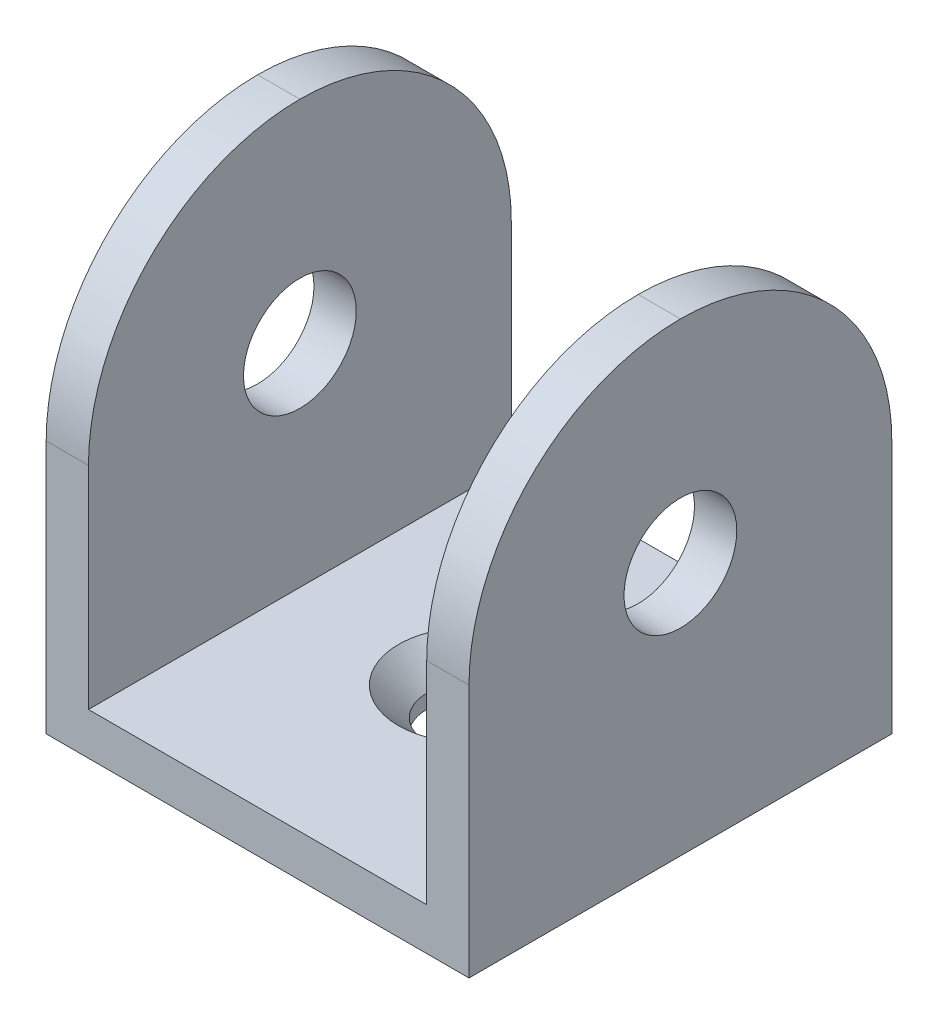
ISO-10303-21;
HEADER;
FILE_DESCRIPTION(('STEP AP214'),'2;1');
FILE_NAME('part.step','',(''),(''),'','','');
FILE_SCHEMA(('AUTOMOTIVE_DESIGN { 1 0 10303 214 1 1 1 1 }'));
ENDSEC;
DATA;
#1=APPLICATION_CONTEXT('core data for automotive mechanical design processes');
#2=APPLICATION_PROTOCOL_DEFINITION('international standard','automotive_design',2000,#1);
#3=PRODUCT_CONTEXT('',#1,'mechanical');
#4=PRODUCT('Part','Part','',(#3));
#5=PRODUCT_RELATED_PRODUCT_CATEGORY('part','',(#4));
#6=PRODUCT_DEFINITION_FORMATION('','',#4);
#7=PRODUCT_DEFINITION_CONTEXT('part definition',#1,'design');
#8=PRODUCT_DEFINITION('design','',#6,#7);
#9=PRODUCT_DEFINITION_SHAPE('','',#8);
#10=(LENGTH_UNIT() NAMED_UNIT(*) SI_UNIT(.MILLI.,.METRE.));
#11=(NAMED_UNIT(*) PLANE_ANGLE_UNIT() SI_UNIT($,.RADIAN.));
#12=(NAMED_UNIT(*) SI_UNIT($,.STERADIAN.) SOLID_ANGLE_UNIT());
#13=UNCERTAINTY_MEASURE_WITH_UNIT(LENGTH_MEASURE(1.E-05),#10,'distance_accuracy_value','');
#14=(GEOMETRIC_REPRESENTATION_CONTEXT(3) GLOBAL_UNCERTAINTY_ASSIGNED_CONTEXT((#13)) GLOBAL_UNIT_ASSIGNED_CONTEXT((#10,
#11,#12)) REPRESENTATION_CONTEXT('',''));
#15=CARTESIAN_POINT('',(0.,0.,0.));
#16=DIRECTION('',(0.,0.,1.));
#17=DIRECTION('',(1.,0.,0.));
#18=AXIS2_PLACEMENT_3D('',#15,#16,#17);
#19=CARTESIAN_POINT('',(0.,3.,0.));
#20=DIRECTION('',(0.,1.,0.));
#21=DIRECTION('',(0.,0.,1.));
#22=AXIS2_PLACEMENT_3D('',#19,#20,#21);
#23=PLANE('',#22);
#24=CARTESIAN_POINT('',(0.,3.,0.));
#25=DIRECTION('',(0.,1.,0.));
#26=DIRECTION('',(0.,0.,1.));
#27=AXIS2_PLACEMENT_3D('',#24,#25,#26);
#28=CIRCLE('',#27,5.00000000000001);
#29=CARTESIAN_POINT('',(0.,3.,5.00000000000001));
#30=VERTEX_POINT('',#29);
#31=EDGE_CURVE('E11',#30,#30,#28,.F.);
#32=ORIENTED_EDGE('',*,*,#31,.T.);
#33=EDGE_LOOP('',(#32));
#34=FACE_BOUND('',#33,.T.);
#35=DIRECTION('',(1.,0.,0.));
#36=VECTOR('',#35,1.);
#37=CARTESIAN_POINT('',(15.,3.,15.));
#38=LINE('',#37,#36);
#39=CARTESIAN_POINT('',(-12.,3.,15.));
#40=VERTEX_POINT('',#39);
#41=CARTESIAN_POINT('',(12.,3.,15.));
#42=VERTEX_POINT('',#41);
#43=EDGE_CURVE('E146',#40,#42,#38,.T.);
#44=ORIENTED_EDGE('',*,*,#43,.T.);
#45=DIRECTION('',(0.,0.,1.));
#46=VECTOR('',#45,1.);
#47=CARTESIAN_POINT('',(12.,3.,-15.));
#48=LINE('',#47,#46);
#49=CARTESIAN_POINT('',(12.,3.,-15.));
#50=VERTEX_POINT('',#49);
#51=EDGE_CURVE('E143',#50,#42,#48,.T.);
#52=ORIENTED_EDGE('',*,*,#51,.F.);
#53=DIRECTION('',(-1.,0.,0.));
#54=VECTOR('',#53,1.);
#55=CARTESIAN_POINT('',(15.,3.,-15.));
#56=LINE('',#55,#54);
#57=CARTESIAN_POINT('',(-12.,3.,-15.));
#58=VERTEX_POINT('',#57);
#59=EDGE_CURVE('E128',#50,#58,#56,.T.);
#60=ORIENTED_EDGE('',*,*,#59,.T.);
#61=DIRECTION('',(0.,0.,-1.));
#62=VECTOR('',#61,1.);
#63=CARTESIAN_POINT('',(-12.,3.,-15.));
#64=LINE('',#63,#62);
#65=EDGE_CURVE('E135',#40,#58,#64,.T.);
#66=ORIENTED_EDGE('',*,*,#65,.F.);
#67=EDGE_LOOP('',(#44,#52,#60,#66));
#68=FACE_BOUND('',#67,.T.);
#69=ADVANCED_FACE('F45',(#34,#68),#23,.T.);
#70=CARTESIAN_POINT('',(-15.,3.,15.));
#71=DIRECTION('',(1.,0.,0.));
#72=DIRECTION('',(0.,0.,-1.));
#73=AXIS2_PLACEMENT_3D('',#70,#71,#72);
#74=PLANE('',#73);
#75=CARTESIAN_POINT('',(-15.,18.,0.));
#76=DIRECTION('',(1.,0.,0.));
#77=DIRECTION('',(0.,0.,-1.));
#78=AXIS2_PLACEMENT_3D('',#75,#76,#77);
#79=CIRCLE('',#78,4.);
#80=CARTESIAN_POINT('',(-15.,18.,-4.));
#81=VERTEX_POINT('',#80);
#82=EDGE_CURVE('E235',#81,#81,#79,.T.);
#83=ORIENTED_EDGE('',*,*,#82,.T.);
#84=EDGE_LOOP('',(#83));
#85=FACE_BOUND('',#84,.T.);
#86=CARTESIAN_POINT('',(-15.,18.,0.));
#87=DIRECTION('',(1.,0.,0.));
#88=DIRECTION('',(0.,0.,-1.));
#89=AXIS2_PLACEMENT_3D('',#86,#87,#88);
#90=CIRCLE('',#89,15.);
#91=CARTESIAN_POINT('',(-15.,18.,15.));
#92=VERTEX_POINT('',#91);
#93=CARTESIAN_POINT('',(-15.,33.,0.));
#94=VERTEX_POINT('',#93);
#95=EDGE_CURVE('E188',#92,#94,#90,.F.);
#96=ORIENTED_EDGE('',*,*,#95,.T.);
#97=CARTESIAN_POINT('',(-15.,18.,0.));
#98=DIRECTION('',(1.,0.,0.));
#99=DIRECTION('',(0.,0.,-1.));
#100=AXIS2_PLACEMENT_3D('',#97,#98,#99);
#101=CIRCLE('',#100,15.);
#102=CARTESIAN_POINT('',(-15.,18.,-15.));
#103=VERTEX_POINT('',#102);
#104=EDGE_CURVE('E191',#94,#103,#101,.F.);
#105=ORIENTED_EDGE('',*,*,#104,.T.);
#106=DIRECTION('',(0.,-1.,0.));
#107=VECTOR('',#106,1.);
#108=CARTESIAN_POINT('',(-15.,3.,-15.));
#109=LINE('',#108,#107);
#110=CARTESIAN_POINT('',(-15.,0.,-15.));
#111=VERTEX_POINT('',#110);
#112=EDGE_CURVE('E145',#103,#111,#109,.T.);
#113=ORIENTED_EDGE('',*,*,#112,.T.);
#114=DIRECTION('',(0.,0.,1.));
#115=VECTOR('',#114,1.);
#116=CARTESIAN_POINT('',(-15.,0.,15.));
#117=LINE('',#116,#115);
#118=CARTESIAN_POINT('',(-15.,0.,15.));
#119=VERTEX_POINT('',#118);
#120=EDGE_CURVE('E159',#111,#119,#117,.T.);
#121=ORIENTED_EDGE('',*,*,#120,.T.);
#122=DIRECTION('',(0.,-1.,0.));
#123=VECTOR('',#122,1.);
#124=CARTESIAN_POINT('',(-15.,3.,15.));
#125=LINE('',#124,#123);
#126=EDGE_CURVE('E185',#92,#119,#125,.T.);
#127=ORIENTED_EDGE('',*,*,#126,.F.);
#128=EDGE_LOOP('',(#96,#105,#113,#121,#127));
#129=FACE_BOUND('',#128,.T.);
#130=ADVANCED_FACE('F252',(#85,#129),#74,.F.);
#131=CARTESIAN_POINT('',(15.,3.,15.));
#132=DIRECTION('',(0.,0.,-1.));
#133=DIRECTION('',(-1.,0.,0.));
#134=AXIS2_PLACEMENT_3D('',#131,#132,#133);
#135=PLANE('',#134);
#136=DIRECTION('',(0.,-1.,0.));
#137=VECTOR('',#136,1.);
#138=CARTESIAN_POINT('',(15.,3.,15.));
#139=LINE('',#138,#137);
#140=CARTESIAN_POINT('',(15.,18.,15.));
#141=VERTEX_POINT('',#140);
#142=CARTESIAN_POINT('',(15.,0.,15.));
#143=VERTEX_POINT('',#142);
#144=EDGE_CURVE('E182',#141,#143,#139,.T.);
#145=ORIENTED_EDGE('',*,*,#144,.F.);
#146=DIRECTION('',(1.,0.,0.));
#147=VECTOR('',#146,1.);
#148=CARTESIAN_POINT('',(15.,18.,15.));
#149=LINE('',#148,#147);
#150=CARTESIAN_POINT('',(12.,18.,15.));
#151=VERTEX_POINT('',#150);
#152=EDGE_CURVE('E219',#141,#151,#149,.F.);
#153=ORIENTED_EDGE('',*,*,#152,.T.);
#154=DIRECTION('',(0.,-1.,0.));
#155=VECTOR('',#154,1.);
#156=CARTESIAN_POINT('',(12.,33.,15.));
#157=LINE('',#156,#155);
#158=EDGE_CURVE('E153',#151,#42,#157,.T.);
#159=ORIENTED_EDGE('',*,*,#158,.T.);
#160=ORIENTED_EDGE('',*,*,#43,.F.);
#161=DIRECTION('',(0.,-1.,0.));
#162=VECTOR('',#161,1.);
#163=CARTESIAN_POINT('',(-12.,33.,15.));
#164=LINE('',#163,#162);
#165=CARTESIAN_POINT('',(-12.,18.,15.));
#166=VERTEX_POINT('',#165);
#167=EDGE_CURVE('E134',#166,#40,#164,.T.);
#168=ORIENTED_EDGE('',*,*,#167,.F.);
#169=DIRECTION('',(1.,0.,0.));
#170=VECTOR('',#169,1.);
#171=CARTESIAN_POINT('',(-15.,18.,15.));
#172=LINE('',#171,#170);
#173=EDGE_CURVE('E216',#166,#92,#172,.F.);
#174=ORIENTED_EDGE('',*,*,#173,.T.);
#175=ORIENTED_EDGE('',*,*,#126,.T.);
#176=DIRECTION('',(1.,0.,0.));
#177=VECTOR('',#176,1.);
#178=CARTESIAN_POINT('',(15.,0.,15.));
#179=LINE('',#178,#177);
#180=EDGE_CURVE('E166',#119,#143,#179,.T.);
#181=ORIENTED_EDGE('',*,*,#180,.T.);
#182=EDGE_LOOP('',(#145,#153,#159,#160,#168,#174,#175,#181));
#183=FACE_BOUND('',#182,.T.);
#184=ADVANCED_FACE('F258',(#183),#135,.F.);
#185=CARTESIAN_POINT('',(15.,3.,15.));
#186=DIRECTION('',(-1.,0.,0.));
#187=DIRECTION('',(0.,0.,1.));
#188=AXIS2_PLACEMENT_3D('',#185,#186,#187);
#189=PLANE('',#188);
#190=CARTESIAN_POINT('',(15.,18.,0.));
#191=DIRECTION('',(1.,0.,0.));
#192=DIRECTION('',(0.,0.,-1.));
#193=AXIS2_PLACEMENT_3D('',#190,#191,#192);
#194=CIRCLE('',#193,4.);
#195=CARTESIAN_POINT('',(15.,18.,-4.));
#196=VERTEX_POINT('',#195);
#197=EDGE_CURVE('E307',#196,#196,#194,.T.);
#198=ORIENTED_EDGE('',*,*,#197,.F.);
#199=EDGE_LOOP('',(#198));
#200=FACE_BOUND('',#199,.T.);
#201=DIRECTION('',(0.,-1.,0.));
#202=VECTOR('',#201,1.);
#203=CARTESIAN_POINT('',(15.,3.,-15.));
#204=LINE('',#203,#202);
#205=CARTESIAN_POINT('',(15.,18.,-15.));
#206=VERTEX_POINT('',#205);
#207=CARTESIAN_POINT('',(15.,0.,-15.));
#208=VERTEX_POINT('',#207);
#209=EDGE_CURVE('E179',#206,#208,#204,.T.);
#210=ORIENTED_EDGE('',*,*,#209,.F.);
#211=CARTESIAN_POINT('',(15.,18.,0.));
#212=DIRECTION('',(-1.,0.,0.));
#213=DIRECTION('',(0.,0.,1.));
#214=AXIS2_PLACEMENT_3D('',#211,#212,#213);
#215=CIRCLE('',#214,15.);
#216=CARTESIAN_POINT('',(15.,33.,0.));
#217=VERTEX_POINT('',#216);
#218=EDGE_CURVE('E67',#206,#217,#215,.F.);
#219=ORIENTED_EDGE('',*,*,#218,.T.);
#220=CARTESIAN_POINT('',(15.,18.,0.));
#221=DIRECTION('',(-1.,0.,0.));
#222=DIRECTION('',(0.,0.,1.));
#223=AXIS2_PLACEMENT_3D('',#220,#221,#222);
#224=CIRCLE('',#223,15.);
#225=EDGE_CURVE('E62',#217,#141,#224,.F.);
#226=ORIENTED_EDGE('',*,*,#225,.T.);
#227=ORIENTED_EDGE('',*,*,#144,.T.);
#228=DIRECTION('',(0.,0.,-1.));
#229=VECTOR('',#228,1.);
#230=CARTESIAN_POINT('',(15.,0.,15.));
#231=LINE('',#230,#229);
#232=EDGE_CURVE('E170',#143,#208,#231,.T.);
#233=ORIENTED_EDGE('',*,*,#232,.T.);
#234=EDGE_LOOP('',(#210,#219,#226,#227,#233));
#235=FACE_BOUND('',#234,.T.);
#236=ADVANCED_FACE('F270',(#200,#235),#189,.F.);
#237=CARTESIAN_POINT('',(15.,3.,-15.));
#238=DIRECTION('',(0.,0.,1.));
#239=DIRECTION('',(1.,0.,0.));
#240=AXIS2_PLACEMENT_3D('',#237,#238,#239);
#241=PLANE('',#240);
#242=ORIENTED_EDGE('',*,*,#112,.F.);
#243=DIRECTION('',(-1.,0.,0.));
#244=VECTOR('',#243,1.);
#245=CARTESIAN_POINT('',(-12.,18.,-15.));
#246=LINE('',#245,#244);
#247=CARTESIAN_POINT('',(-12.,18.,-15.));
#248=VERTEX_POINT('',#247);
#249=EDGE_CURVE('E130',#103,#248,#246,.F.);
#250=ORIENTED_EDGE('',*,*,#249,.T.);
#251=DIRECTION('',(0.,-1.,0.));
#252=VECTOR('',#251,1.);
#253=CARTESIAN_POINT('',(-12.,33.,-15.));
#254=LINE('',#253,#252);
#255=EDGE_CURVE('E123',#248,#58,#254,.T.);
#256=ORIENTED_EDGE('',*,*,#255,.T.);
#257=ORIENTED_EDGE('',*,*,#59,.F.);
#258=DIRECTION('',(0.,-1.,0.));
#259=VECTOR('',#258,1.);
#260=CARTESIAN_POINT('',(12.,33.,-15.));
#261=LINE('',#260,#259);
#262=CARTESIAN_POINT('',(12.,18.,-15.));
#263=VERTEX_POINT('',#262);
#264=EDGE_CURVE('E226',#263,#50,#261,.T.);
#265=ORIENTED_EDGE('',*,*,#264,.F.);
#266=DIRECTION('',(-1.,0.,0.));
#267=VECTOR('',#266,1.);
#268=CARTESIAN_POINT('',(15.,18.,-15.));
#269=LINE('',#268,#267);
#270=EDGE_CURVE('E194',#263,#206,#269,.F.);
#271=ORIENTED_EDGE('',*,*,#270,.T.);
#272=ORIENTED_EDGE('',*,*,#209,.T.);
#273=DIRECTION('',(-1.,0.,0.));
#274=VECTOR('',#273,1.);
#275=CARTESIAN_POINT('',(15.,0.,-15.));
#276=LINE('',#275,#274);
#277=EDGE_CURVE('E161',#208,#111,#276,.T.);
#278=ORIENTED_EDGE('',*,*,#277,.T.);
#279=EDGE_LOOP('',(#242,#250,#256,#257,#265,#271,#272,#278));
#280=FACE_BOUND('',#279,.T.);
#281=ADVANCED_FACE('F126',(#280),#241,.F.);
#282=CARTESIAN_POINT('',(0.,0.,0.));
#283=DIRECTION('',(0.,1.,0.));
#284=DIRECTION('',(0.,0.,1.));
#285=AXIS2_PLACEMENT_3D('',#282,#283,#284);
#286=PLANE('',#285);
#287=CARTESIAN_POINT('',(0.,0.,0.));
#288=DIRECTION('',(0.,1.,0.));
#289=DIRECTION('',(0.,0.,1.));
#290=AXIS2_PLACEMENT_3D('',#287,#288,#289);
#291=CIRCLE('',#290,3.);
#292=CARTESIAN_POINT('',(0.,0.,3.));
#293=VERTEX_POINT('',#292);
#294=EDGE_CURVE('E311',#293,#293,#291,.T.);
#295=ORIENTED_EDGE('',*,*,#294,.T.);
#296=EDGE_LOOP('',(#295));
#297=FACE_BOUND('',#296,.T.);
#298=ORIENTED_EDGE('',*,*,#120,.F.);
#299=ORIENTED_EDGE('',*,*,#277,.F.);
#300=ORIENTED_EDGE('',*,*,#232,.F.);
#301=ORIENTED_EDGE('',*,*,#180,.F.);
#302=EDGE_LOOP('',(#298,#299,#300,#301));
#303=FACE_BOUND('',#302,.T.);
#304=ADVANCED_FACE('F264',(#297,#303),#286,.F.);
#305=CARTESIAN_POINT('',(-12.,33.,-15.));
#306=DIRECTION('',(-1.,0.,0.));
#307=DIRECTION('',(0.,0.,1.));
#308=AXIS2_PLACEMENT_3D('',#305,#306,#307);
#309=PLANE('',#308);
#310=CARTESIAN_POINT('',(-12.,18.,0.));
#311=DIRECTION('',(-1.,0.,0.));
#312=DIRECTION('',(0.,0.,1.));
#313=AXIS2_PLACEMENT_3D('',#310,#311,#312);
#314=CIRCLE('',#313,4.);
#315=CARTESIAN_POINT('',(-12.,18.,4.));
#316=VERTEX_POINT('',#315);
#317=EDGE_CURVE('E231',#316,#316,#314,.T.);
#318=ORIENTED_EDGE('',*,*,#317,.T.);
#319=EDGE_LOOP('',(#318));
#320=FACE_BOUND('',#319,.T.);
#321=ORIENTED_EDGE('',*,*,#255,.F.);
#322=CARTESIAN_POINT('',(-12.,18.,0.));
#323=DIRECTION('',(-1.,0.,0.));
#324=DIRECTION('',(0.,0.,1.));
#325=AXIS2_PLACEMENT_3D('',#322,#323,#324);
#326=CIRCLE('',#325,15.);
#327=CARTESIAN_POINT('',(-12.,33.,0.));
#328=VERTEX_POINT('',#327);
#329=EDGE_CURVE('E203',#248,#328,#326,.F.);
#330=ORIENTED_EDGE('',*,*,#329,.T.);
#331=CARTESIAN_POINT('',(-12.,18.,0.));
#332=DIRECTION('',(-1.,0.,0.));
#333=DIRECTION('',(0.,0.,1.));
#334=AXIS2_PLACEMENT_3D('',#331,#332,#333);
#335=CIRCLE('',#334,15.);
#336=EDGE_CURVE('E200',#328,#166,#335,.F.);
#337=ORIENTED_EDGE('',*,*,#336,.T.);
#338=ORIENTED_EDGE('',*,*,#167,.T.);
#339=ORIENTED_EDGE('',*,*,#65,.T.);
#340=EDGE_LOOP('',(#321,#330,#337,#338,#339));
#341=FACE_BOUND('',#340,.T.);
#342=ADVANCED_FACE('F148',(#320,#341),#309,.F.);
#343=CARTESIAN_POINT('',(12.,33.,-15.));
#344=DIRECTION('',(1.,0.,0.));
#345=DIRECTION('',(0.,0.,-1.));
#346=AXIS2_PLACEMENT_3D('',#343,#344,#345);
#347=PLANE('',#346);
#348=CARTESIAN_POINT('',(12.,18.,0.));
#349=DIRECTION('',(1.,0.,0.));
#350=DIRECTION('',(0.,0.,-1.));
#351=AXIS2_PLACEMENT_3D('',#348,#349,#350);
#352=CIRCLE('',#351,4.);
#353=CARTESIAN_POINT('',(12.,18.,-4.));
#354=VERTEX_POINT('',#353);
#355=EDGE_CURVE('E232',#354,#354,#352,.T.);
#356=ORIENTED_EDGE('',*,*,#355,.T.);
#357=EDGE_LOOP('',(#356));
#358=FACE_BOUND('',#357,.T.);
#359=CARTESIAN_POINT('',(12.,18.,0.));
#360=DIRECTION('',(1.,0.,0.));
#361=DIRECTION('',(0.,0.,-1.));
#362=AXIS2_PLACEMENT_3D('',#359,#360,#361);
#363=CIRCLE('',#362,15.);
#364=CARTESIAN_POINT('',(12.,33.,0.));
#365=VERTEX_POINT('',#364);
#366=EDGE_CURVE('E206',#151,#365,#363,.F.);
#367=ORIENTED_EDGE('',*,*,#366,.T.);
#368=CARTESIAN_POINT('',(12.,18.,0.));
#369=DIRECTION('',(1.,0.,0.));
#370=DIRECTION('',(0.,0.,-1.));
#371=AXIS2_PLACEMENT_3D('',#368,#369,#370);
#372=CIRCLE('',#371,15.);
#373=EDGE_CURVE('E209',#365,#263,#372,.F.);
#374=ORIENTED_EDGE('',*,*,#373,.T.);
#375=ORIENTED_EDGE('',*,*,#264,.T.);
#376=ORIENTED_EDGE('',*,*,#51,.T.);
#377=ORIENTED_EDGE('',*,*,#158,.F.);
#378=EDGE_LOOP('',(#367,#374,#375,#376,#377));
#379=FACE_BOUND('',#378,.T.);
#380=ADVANCED_FACE('F285',(#358,#379),#347,.F.);
#381=CARTESIAN_POINT('',(0.,18.,0.));
#382=DIRECTION('',(-1.,0.,0.));
#383=DIRECTION('',(0.,0.,1.));
#384=AXIS2_PLACEMENT_3D('',#381,#382,#383);
#385=CYLINDRICAL_SURFACE('',#384,15.);
#386=ORIENTED_EDGE('',*,*,#173,.F.);
#387=ORIENTED_EDGE('',*,*,#336,.F.);
#388=DIRECTION('',(1.,0.,0.));
#389=VECTOR('',#388,1.);
#390=CARTESIAN_POINT('',(-12.,33.,0.));
#391=LINE('',#390,#389);
#392=EDGE_CURVE('E222',#94,#328,#391,.T.);
#393=ORIENTED_EDGE('',*,*,#392,.F.);
#394=ORIENTED_EDGE('',*,*,#95,.F.);
#395=EDGE_LOOP('',(#386,#387,#393,#394));
#396=FACE_BOUND('',#395,.T.);
#397=ADVANCED_FACE('F281',(#396),#385,.T.);
#398=CARTESIAN_POINT('',(0.,18.,0.));
#399=DIRECTION('',(1.,0.,0.));
#400=DIRECTION('',(0.,0.,-1.));
#401=AXIS2_PLACEMENT_3D('',#398,#399,#400);
#402=CYLINDRICAL_SURFACE('',#401,15.);
#403=ORIENTED_EDGE('',*,*,#329,.F.);
#404=ORIENTED_EDGE('',*,*,#249,.F.);
#405=ORIENTED_EDGE('',*,*,#104,.F.);
#406=ORIENTED_EDGE('',*,*,#392,.T.);
#407=EDGE_LOOP('',(#403,#404,#405,#406));
#408=FACE_BOUND('',#407,.T.);
#409=ADVANCED_FACE('F277',(#408),#402,.T.);
#410=CARTESIAN_POINT('',(0.,18.,0.));
#411=DIRECTION('',(1.,0.,0.));
#412=DIRECTION('',(0.,0.,-1.));
#413=AXIS2_PLACEMENT_3D('',#410,#411,#412);
#414=CYLINDRICAL_SURFACE('',#413,15.);
#415=ORIENTED_EDGE('',*,*,#152,.F.);
#416=ORIENTED_EDGE('',*,*,#225,.F.);
#417=DIRECTION('',(1.,0.,0.));
#418=VECTOR('',#417,1.);
#419=CARTESIAN_POINT('',(0.,33.,0.));
#420=LINE('',#419,#418);
#421=EDGE_CURVE('E227',#365,#217,#420,.T.);
#422=ORIENTED_EDGE('',*,*,#421,.F.);
#423=ORIENTED_EDGE('',*,*,#366,.F.);
#424=EDGE_LOOP('',(#415,#416,#422,#423));
#425=FACE_BOUND('',#424,.T.);
#426=ADVANCED_FACE('F280',(#425),#414,.T.);
#427=CARTESIAN_POINT('',(0.,18.,0.));
#428=DIRECTION('',(-1.,0.,0.));
#429=DIRECTION('',(0.,0.,1.));
#430=AXIS2_PLACEMENT_3D('',#427,#428,#429);
#431=CYLINDRICAL_SURFACE('',#430,15.);
#432=ORIENTED_EDGE('',*,*,#218,.F.);
#433=ORIENTED_EDGE('',*,*,#270,.F.);
#434=ORIENTED_EDGE('',*,*,#373,.F.);
#435=ORIENTED_EDGE('',*,*,#421,.T.);
#436=EDGE_LOOP('',(#432,#433,#434,#435));
#437=FACE_BOUND('',#436,.T.);
#438=ADVANCED_FACE('F287',(#437),#431,.T.);
#439=CARTESIAN_POINT('',(-15.,18.,0.));
#440=DIRECTION('',(1.,0.,0.));
#441=DIRECTION('',(0.,0.,-1.));
#442=AXIS2_PLACEMENT_3D('',#439,#440,#441);
#443=CYLINDRICAL_SURFACE('',#442,4.);
#444=ORIENTED_EDGE('',*,*,#197,.T.);
#445=EDGE_LOOP('',(#444));
#446=FACE_BOUND('',#445,.T.);
#447=ORIENTED_EDGE('',*,*,#355,.F.);
#448=EDGE_LOOP('',(#447));
#449=FACE_BOUND('',#448,.T.);
#450=ADVANCED_FACE('F289',(#446,#449),#443,.F.);
#451=ORIENTED_EDGE('',*,*,#82,.F.);
#452=EDGE_LOOP('',(#451));
#453=FACE_BOUND('',#452,.T.);
#454=ORIENTED_EDGE('',*,*,#317,.F.);
#455=EDGE_LOOP('',(#454));
#456=FACE_BOUND('',#455,.T.);
#457=ADVANCED_FACE('F248',(#453,#456),#443,.F.);
#458=CARTESIAN_POINT('',(0.,0.,0.));
#459=DIRECTION('',(0.,1.,0.));
#460=DIRECTION('',(0.,0.,1.));
#461=AXIS2_PLACEMENT_3D('',#458,#459,#460);
#462=CYLINDRICAL_SURFACE('',#461,3.);
#463=CARTESIAN_POINT('',(0.,0.999999999999999,0.));
#464=DIRECTION('',(0.,1.,0.));
#465=DIRECTION('',(0.,0.,1.));
#466=AXIS2_PLACEMENT_3D('',#463,#464,#465);
#467=CIRCLE('',#466,3.);
#468=CARTESIAN_POINT('',(0.,0.999999999999999,3.));
#469=VERTEX_POINT('',#468);
#470=EDGE_CURVE('E55',#469,#469,#467,.T.);
#471=ORIENTED_EDGE('',*,*,#470,.T.);
#472=EDGE_LOOP('',(#471));
#473=FACE_BOUND('',#472,.T.);
#474=ORIENTED_EDGE('',*,*,#294,.F.);
#475=EDGE_LOOP('',(#474));
#476=FACE_BOUND('',#475,.T.);
#477=ADVANCED_FACE('F240',(#473,#476),#462,.F.);
#478=CARTESIAN_POINT('',(0.,0.999999999999999,0.));
#479=DIRECTION('',(0.,1.,0.));
#480=DIRECTION('',(0.,0.,1.));
#481=AXIS2_PLACEMENT_3D('',#478,#479,#480);
#482=CONICAL_SURFACE('',#481,3.,0.785398163397451);
#483=ORIENTED_EDGE('',*,*,#31,.F.);
#484=EDGE_LOOP('',(#483));
#485=FACE_BOUND('',#484,.T.);
#486=ORIENTED_EDGE('',*,*,#470,.F.);
#487=EDGE_LOOP('',(#486));
#488=FACE_BOUND('',#487,.T.);
#489=ADVANCED_FACE('F48',(#485,#488),#482,.F.);
#490=CLOSED_SHELL('',(#69,#130,#184,#236,#281,#304,#342,#380,#397,#409,#426,#438,#450,#457,#477,#489));
#491=MANIFOLD_SOLID_BREP('B2',#490);
#492=ADVANCED_BREP_SHAPE_REPRESENTATION('',(#18,#491),#14);
#493=SHAPE_DEFINITION_REPRESENTATION(#9,#492);
ENDSEC;
END-ISO-10303-21;
